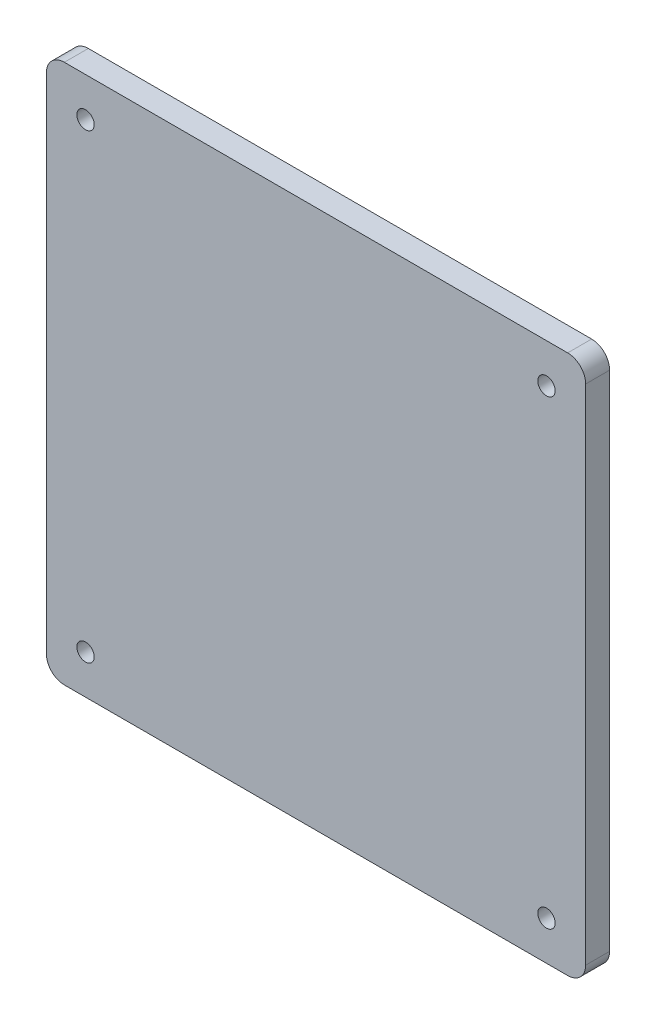
ISO-10303-21;
HEADER;
FILE_DESCRIPTION(('STEP AP214'),'2;1');
FILE_NAME('part.step','',(''),(''),'','','');
FILE_SCHEMA(('AUTOMOTIVE_DESIGN { 1 0 10303 214 1 1 1 1 }'));
ENDSEC;
DATA;
#1=APPLICATION_CONTEXT('core data for automotive mechanical design processes');
#2=APPLICATION_PROTOCOL_DEFINITION('international standard','automotive_design',2000,#1);
#3=PRODUCT_CONTEXT('',#1,'mechanical');
#4=PRODUCT('Part','Part','',(#3));
#5=PRODUCT_RELATED_PRODUCT_CATEGORY('part','',(#4));
#6=PRODUCT_DEFINITION_FORMATION('','',#4);
#7=PRODUCT_DEFINITION_CONTEXT('part definition',#1,'design');
#8=PRODUCT_DEFINITION('design','',#6,#7);
#9=PRODUCT_DEFINITION_SHAPE('','',#8);
#10=(LENGTH_UNIT() NAMED_UNIT(*) SI_UNIT(.MILLI.,.METRE.));
#11=(NAMED_UNIT(*) PLANE_ANGLE_UNIT() SI_UNIT($,.RADIAN.));
#12=(NAMED_UNIT(*) SI_UNIT($,.STERADIAN.) SOLID_ANGLE_UNIT());
#13=UNCERTAINTY_MEASURE_WITH_UNIT(LENGTH_MEASURE(1.E-05),#10,'distance_accuracy_value','');
#14=(GEOMETRIC_REPRESENTATION_CONTEXT(3) GLOBAL_UNCERTAINTY_ASSIGNED_CONTEXT((#13)) GLOBAL_UNIT_ASSIGNED_CONTEXT((#10,
#11,#12)) REPRESENTATION_CONTEXT('',''));
#15=CARTESIAN_POINT('',(0.,0.,0.));
#16=DIRECTION('',(0.,0.,1.));
#17=DIRECTION('',(1.,0.,0.));
#18=AXIS2_PLACEMENT_3D('',#15,#16,#17);
#19=CARTESIAN_POINT('',(42.0000000000008,42.000000000001,4.));
#20=DIRECTION('',(0.,0.,1.));
#21=DIRECTION('',(1.,0.,0.));
#22=AXIS2_PLACEMENT_3D('',#19,#20,#21);
#23=PLANE('',#22);
#24=CARTESIAN_POINT('',(38.4644660940683,38.4644660940681,4.));
#25=DIRECTION('',(0.,0.,1.));
#26=DIRECTION('',(1.,0.,0.));
#27=AXIS2_PLACEMENT_3D('',#24,#25,#26);
#28=CIRCLE('',#27,1.45000000000001);
#29=CARTESIAN_POINT('',(39.9144660940683,38.4644660940681,4.));
#30=VERTEX_POINT('',#29);
#31=EDGE_CURVE('E194',#30,#30,#28,.T.);
#32=ORIENTED_EDGE('',*,*,#31,.F.);
#33=EDGE_LOOP('',(#32));
#34=FACE_BOUND('',#33,.T.);
#35=CARTESIAN_POINT('',(-38.4644660940686,-38.4644660940678,4.));
#36=DIRECTION('',(0.,0.,1.));
#37=DIRECTION('',(1.,0.,0.));
#38=AXIS2_PLACEMENT_3D('',#35,#36,#37);
#39=CIRCLE('',#38,1.45);
#40=CARTESIAN_POINT('',(-37.0144660940686,-38.4644660940678,4.));
#41=VERTEX_POINT('',#40);
#42=EDGE_CURVE('E140',#41,#41,#39,.T.);
#43=ORIENTED_EDGE('',*,*,#42,.F.);
#44=EDGE_LOOP('',(#43));
#45=FACE_BOUND('',#44,.T.);
#46=CARTESIAN_POINT('',(42.0000000000008,42.000000000001,4.));
#47=DIRECTION('',(0.,0.,1.));
#48=DIRECTION('',(1.,0.,0.));
#49=AXIS2_PLACEMENT_3D('',#46,#47,#48);
#50=CIRCLE('',#49,3.);
#51=CARTESIAN_POINT('',(45.0000000000008,42.000000000001,4.));
#52=VERTEX_POINT('',#51);
#53=CARTESIAN_POINT('',(42.0000000000008,45.000000000001,4.));
#54=VERTEX_POINT('',#53);
#55=EDGE_CURVE('E151',#52,#54,#50,.T.);
#56=ORIENTED_EDGE('',*,*,#55,.T.);
#57=DIRECTION('',(-1.,0.,0.));
#58=VECTOR('',#57,1.);
#59=CARTESIAN_POINT('',(42.0000000000008,45.000000000001,4.));
#60=LINE('',#59,#58);
#61=CARTESIAN_POINT('',(-42.0000000000009,45.000000000001,4.));
#62=VERTEX_POINT('',#61);
#63=EDGE_CURVE('E99',#54,#62,#60,.T.);
#64=ORIENTED_EDGE('',*,*,#63,.T.);
#65=CARTESIAN_POINT('',(-42.0000000000009,42.000000000001,4.));
#66=DIRECTION('',(0.,0.,1.));
#67=DIRECTION('',(1.,0.,0.));
#68=AXIS2_PLACEMENT_3D('',#65,#66,#67);
#69=CIRCLE('',#68,3.);
#70=CARTESIAN_POINT('',(-45.0000000000009,42.000000000001,4.));
#71=VERTEX_POINT('',#70);
#72=EDGE_CURVE('E166',#62,#71,#69,.T.);
#73=ORIENTED_EDGE('',*,*,#72,.T.);
#74=DIRECTION('',(0.,-1.,0.));
#75=VECTOR('',#74,1.);
#76=CARTESIAN_POINT('',(-45.0000000000009,42.000000000001,4.));
#77=LINE('',#76,#75);
#78=CARTESIAN_POINT('',(-45.0000000000009,-41.9999999999992,4.));
#79=VERTEX_POINT('',#78);
#80=EDGE_CURVE('E179',#71,#79,#77,.T.);
#81=ORIENTED_EDGE('',*,*,#80,.T.);
#82=CARTESIAN_POINT('',(-42.0000000000009,-41.9999999999992,4.));
#83=DIRECTION('',(0.,0.,1.));
#84=DIRECTION('',(1.,0.,0.));
#85=AXIS2_PLACEMENT_3D('',#82,#83,#84);
#86=CIRCLE('',#85,3.);
#87=CARTESIAN_POINT('',(-42.0000000000009,-44.9999999999992,4.));
#88=VERTEX_POINT('',#87);
#89=EDGE_CURVE('E118',#79,#88,#86,.T.);
#90=ORIENTED_EDGE('',*,*,#89,.T.);
#91=DIRECTION('',(1.,0.,0.));
#92=VECTOR('',#91,1.);
#93=CARTESIAN_POINT('',(42.,-45.,4.));
#94=LINE('',#93,#92);
#95=CARTESIAN_POINT('',(42.,-45.,4.));
#96=VERTEX_POINT('',#95);
#97=EDGE_CURVE('E112',#88,#96,#94,.T.);
#98=ORIENTED_EDGE('',*,*,#97,.T.);
#99=CARTESIAN_POINT('',(42.,-42.,4.));
#100=DIRECTION('',(0.,0.,1.));
#101=DIRECTION('',(1.,0.,0.));
#102=AXIS2_PLACEMENT_3D('',#99,#100,#101);
#103=CIRCLE('',#102,3.);
#104=CARTESIAN_POINT('',(45.,-42.,4.));
#105=VERTEX_POINT('',#104);
#106=EDGE_CURVE('E116',#96,#105,#103,.T.);
#107=ORIENTED_EDGE('',*,*,#106,.T.);
#108=DIRECTION('',(0.,1.,0.));
#109=VECTOR('',#108,1.);
#110=CARTESIAN_POINT('',(45.0000000000008,42.000000000001,4.));
#111=LINE('',#110,#109);
#112=EDGE_CURVE('E56',#105,#52,#111,.T.);
#113=ORIENTED_EDGE('',*,*,#112,.T.);
#114=EDGE_LOOP('',(#56,#64,#73,#81,#90,#98,#107,#113));
#115=FACE_BOUND('',#114,.T.);
#116=CARTESIAN_POINT('',(38.4644660940679,-38.4644660940685,4.));
#117=DIRECTION('',(0.,0.,1.));
#118=DIRECTION('',(1.,0.,0.));
#119=AXIS2_PLACEMENT_3D('',#116,#117,#118);
#120=CIRCLE('',#119,1.44999999999999);
#121=CARTESIAN_POINT('',(39.9144660940679,-38.4644660940685,4.));
#122=VERTEX_POINT('',#121);
#123=EDGE_CURVE('E188',#122,#122,#120,.T.);
#124=ORIENTED_EDGE('',*,*,#123,.F.);
#125=EDGE_LOOP('',(#124));
#126=FACE_BOUND('',#125,.T.);
#127=CARTESIAN_POINT('',(-38.4644660940682,38.4644660940682,4.));
#128=DIRECTION('',(0.,0.,1.));
#129=DIRECTION('',(1.,0.,0.));
#130=AXIS2_PLACEMENT_3D('',#127,#128,#129);
#131=CIRCLE('',#130,1.45);
#132=CARTESIAN_POINT('',(-37.0144660940682,38.4644660940682,4.));
#133=VERTEX_POINT('',#132);
#134=EDGE_CURVE('E200',#133,#133,#131,.T.);
#135=ORIENTED_EDGE('',*,*,#134,.F.);
#136=EDGE_LOOP('',(#135));
#137=FACE_BOUND('',#136,.T.);
#138=ADVANCED_FACE('F39',(#34,#45,#115,#126,#137),#23,.T.);
#139=CARTESIAN_POINT('',(42.0000000000008,42.000000000001,0.));
#140=DIRECTION('',(0.,0.,1.));
#141=DIRECTION('',(1.,0.,0.));
#142=AXIS2_PLACEMENT_3D('',#139,#140,#141);
#143=PLANE('',#142);
#144=CARTESIAN_POINT('',(42.0000000000008,42.000000000001,0.));
#145=DIRECTION('',(0.,0.,1.));
#146=DIRECTION('',(1.,0.,0.));
#147=AXIS2_PLACEMENT_3D('',#144,#145,#146);
#148=CIRCLE('',#147,3.);
#149=CARTESIAN_POINT('',(45.0000000000008,42.000000000001,0.));
#150=VERTEX_POINT('',#149);
#151=CARTESIAN_POINT('',(42.0000000000008,45.000000000001,0.));
#152=VERTEX_POINT('',#151);
#153=EDGE_CURVE('E136',#150,#152,#148,.T.);
#154=ORIENTED_EDGE('',*,*,#153,.F.);
#155=DIRECTION('',(0.,1.,0.));
#156=VECTOR('',#155,1.);
#157=CARTESIAN_POINT('',(45.0000000000008,42.000000000001,0.));
#158=LINE('',#157,#156);
#159=CARTESIAN_POINT('',(45.,-42.,0.));
#160=VERTEX_POINT('',#159);
#161=EDGE_CURVE('E91',#160,#150,#158,.T.);
#162=ORIENTED_EDGE('',*,*,#161,.F.);
#163=CARTESIAN_POINT('',(42.,-42.,0.));
#164=DIRECTION('',(0.,0.,1.));
#165=DIRECTION('',(1.,0.,0.));
#166=AXIS2_PLACEMENT_3D('',#163,#164,#165);
#167=CIRCLE('',#166,3.);
#168=CARTESIAN_POINT('',(42.,-45.,0.));
#169=VERTEX_POINT('',#168);
#170=EDGE_CURVE('E85',#169,#160,#167,.T.);
#171=ORIENTED_EDGE('',*,*,#170,.F.);
#172=DIRECTION('',(1.,0.,0.));
#173=VECTOR('',#172,1.);
#174=CARTESIAN_POINT('',(42.,-45.,0.));
#175=LINE('',#174,#173);
#176=CARTESIAN_POINT('',(-42.0000000000009,-44.9999999999992,0.));
#177=VERTEX_POINT('',#176);
#178=EDGE_CURVE('E126',#177,#169,#175,.T.);
#179=ORIENTED_EDGE('',*,*,#178,.F.);
#180=CARTESIAN_POINT('',(-42.0000000000009,-41.9999999999992,0.));
#181=DIRECTION('',(0.,0.,1.));
#182=DIRECTION('',(1.,0.,0.));
#183=AXIS2_PLACEMENT_3D('',#180,#181,#182);
#184=CIRCLE('',#183,3.);
#185=CARTESIAN_POINT('',(-45.0000000000009,-41.9999999999992,0.));
#186=VERTEX_POINT('',#185);
#187=EDGE_CURVE('E146',#186,#177,#184,.T.);
#188=ORIENTED_EDGE('',*,*,#187,.F.);
#189=DIRECTION('',(0.,-1.,0.));
#190=VECTOR('',#189,1.);
#191=CARTESIAN_POINT('',(-45.0000000000009,42.000000000001,0.));
#192=LINE('',#191,#190);
#193=CARTESIAN_POINT('',(-45.0000000000009,42.000000000001,0.));
#194=VERTEX_POINT('',#193);
#195=EDGE_CURVE('E144',#194,#186,#192,.T.);
#196=ORIENTED_EDGE('',*,*,#195,.F.);
#197=CARTESIAN_POINT('',(-42.0000000000009,42.000000000001,0.));
#198=DIRECTION('',(0.,0.,1.));
#199=DIRECTION('',(1.,0.,0.));
#200=AXIS2_PLACEMENT_3D('',#197,#198,#199);
#201=CIRCLE('',#200,3.);
#202=CARTESIAN_POINT('',(-42.0000000000009,45.000000000001,0.));
#203=VERTEX_POINT('',#202);
#204=EDGE_CURVE('E142',#203,#194,#201,.T.);
#205=ORIENTED_EDGE('',*,*,#204,.F.);
#206=DIRECTION('',(-1.,0.,0.));
#207=VECTOR('',#206,1.);
#208=CARTESIAN_POINT('',(42.0000000000008,45.000000000001,0.));
#209=LINE('',#208,#207);
#210=EDGE_CURVE('E139',#152,#203,#209,.T.);
#211=ORIENTED_EDGE('',*,*,#210,.F.);
#212=EDGE_LOOP('',(#154,#162,#171,#179,#188,#196,#205,#211));
#213=FACE_BOUND('',#212,.T.);
#214=CARTESIAN_POINT('',(-38.4644660940686,-38.4644660940678,0.));
#215=DIRECTION('',(0.,0.,1.));
#216=DIRECTION('',(1.,0.,0.));
#217=AXIS2_PLACEMENT_3D('',#214,#215,#216);
#218=CIRCLE('',#217,1.45);
#219=CARTESIAN_POINT('',(-37.0144660940686,-38.4644660940678,0.));
#220=VERTEX_POINT('',#219);
#221=EDGE_CURVE('E185',#220,#220,#218,.T.);
#222=ORIENTED_EDGE('',*,*,#221,.T.);
#223=EDGE_LOOP('',(#222));
#224=FACE_BOUND('',#223,.T.);
#225=CARTESIAN_POINT('',(38.4644660940679,-38.4644660940685,0.));
#226=DIRECTION('',(0.,0.,1.));
#227=DIRECTION('',(1.,0.,0.));
#228=AXIS2_PLACEMENT_3D('',#225,#226,#227);
#229=CIRCLE('',#228,1.44999999999999);
#230=CARTESIAN_POINT('',(39.9144660940679,-38.4644660940685,0.));
#231=VERTEX_POINT('',#230);
#232=EDGE_CURVE('E191',#231,#231,#229,.T.);
#233=ORIENTED_EDGE('',*,*,#232,.T.);
#234=EDGE_LOOP('',(#233));
#235=FACE_BOUND('',#234,.T.);
#236=CARTESIAN_POINT('',(38.4644660940683,38.4644660940681,0.));
#237=DIRECTION('',(0.,0.,1.));
#238=DIRECTION('',(1.,0.,0.));
#239=AXIS2_PLACEMENT_3D('',#236,#237,#238);
#240=CIRCLE('',#239,1.45000000000001);
#241=CARTESIAN_POINT('',(39.9144660940683,38.4644660940681,0.));
#242=VERTEX_POINT('',#241);
#243=EDGE_CURVE('E197',#242,#242,#240,.T.);
#244=ORIENTED_EDGE('',*,*,#243,.T.);
#245=EDGE_LOOP('',(#244));
#246=FACE_BOUND('',#245,.T.);
#247=CARTESIAN_POINT('',(-38.4644660940682,38.4644660940682,0.));
#248=DIRECTION('',(0.,0.,1.));
#249=DIRECTION('',(1.,0.,0.));
#250=AXIS2_PLACEMENT_3D('',#247,#248,#249);
#251=CIRCLE('',#250,1.45);
#252=CARTESIAN_POINT('',(-37.0144660940682,38.4644660940682,0.));
#253=VERTEX_POINT('',#252);
#254=EDGE_CURVE('E203',#253,#253,#251,.T.);
#255=ORIENTED_EDGE('',*,*,#254,.T.);
#256=EDGE_LOOP('',(#255));
#257=FACE_BOUND('',#256,.T.);
#258=ADVANCED_FACE('F170',(#213,#224,#235,#246,#257),#143,.F.);
#259=CARTESIAN_POINT('',(42.0000000000008,42.000000000001,4.));
#260=DIRECTION('',(0.,0.,-1.));
#261=DIRECTION('',(-1.,0.,0.));
#262=AXIS2_PLACEMENT_3D('',#259,#260,#261);
#263=CYLINDRICAL_SURFACE('',#262,3.);
#264=ORIENTED_EDGE('',*,*,#153,.T.);
#265=DIRECTION('',(0.,0.,-1.));
#266=VECTOR('',#265,1.);
#267=CARTESIAN_POINT('',(42.0000000000008,45.000000000001,4.));
#268=LINE('',#267,#266);
#269=EDGE_CURVE('E11',#54,#152,#268,.T.);
#270=ORIENTED_EDGE('',*,*,#269,.F.);
#271=ORIENTED_EDGE('',*,*,#55,.F.);
#272=DIRECTION('',(0.,0.,-1.));
#273=VECTOR('',#272,1.);
#274=CARTESIAN_POINT('',(45.0000000000008,42.000000000001,4.));
#275=LINE('',#274,#273);
#276=EDGE_CURVE('E132',#52,#150,#275,.T.);
#277=ORIENTED_EDGE('',*,*,#276,.T.);
#278=EDGE_LOOP('',(#264,#270,#271,#277));
#279=FACE_BOUND('',#278,.T.);
#280=ADVANCED_FACE('F41',(#279),#263,.T.);
#281=CARTESIAN_POINT('',(42.0000000000008,45.000000000001,4.));
#282=DIRECTION('',(0.,-1.,0.));
#283=DIRECTION('',(0.,0.,-1.));
#284=AXIS2_PLACEMENT_3D('',#281,#282,#283);
#285=PLANE('',#284);
#286=ORIENTED_EDGE('',*,*,#210,.T.);
#287=DIRECTION('',(0.,0.,-1.));
#288=VECTOR('',#287,1.);
#289=CARTESIAN_POINT('',(-42.0000000000009,45.000000000001,4.));
#290=LINE('',#289,#288);
#291=EDGE_CURVE('E48',#62,#203,#290,.T.);
#292=ORIENTED_EDGE('',*,*,#291,.F.);
#293=ORIENTED_EDGE('',*,*,#63,.F.);
#294=ORIENTED_EDGE('',*,*,#269,.T.);
#295=EDGE_LOOP('',(#286,#292,#293,#294));
#296=FACE_BOUND('',#295,.T.);
#297=ADVANCED_FACE('F237',(#296),#285,.F.);
#298=CARTESIAN_POINT('',(-42.0000000000009,42.000000000001,4.));
#299=DIRECTION('',(0.,0.,-1.));
#300=DIRECTION('',(-1.,0.,0.));
#301=AXIS2_PLACEMENT_3D('',#298,#299,#300);
#302=CYLINDRICAL_SURFACE('',#301,3.);
#303=ORIENTED_EDGE('',*,*,#204,.T.);
#304=DIRECTION('',(0.,0.,-1.));
#305=VECTOR('',#304,1.);
#306=CARTESIAN_POINT('',(-45.0000000000009,42.000000000001,4.));
#307=LINE('',#306,#305);
#308=EDGE_CURVE('E158',#71,#194,#307,.T.);
#309=ORIENTED_EDGE('',*,*,#308,.F.);
#310=ORIENTED_EDGE('',*,*,#72,.F.);
#311=ORIENTED_EDGE('',*,*,#291,.T.);
#312=EDGE_LOOP('',(#303,#309,#310,#311));
#313=FACE_BOUND('',#312,.T.);
#314=ADVANCED_FACE('F164',(#313),#302,.T.);
#315=CARTESIAN_POINT('',(-45.0000000000009,42.000000000001,4.));
#316=DIRECTION('',(1.,0.,0.));
#317=DIRECTION('',(0.,0.,-1.));
#318=AXIS2_PLACEMENT_3D('',#315,#316,#317);
#319=PLANE('',#318);
#320=ORIENTED_EDGE('',*,*,#195,.T.);
#321=DIRECTION('',(0.,0.,-1.));
#322=VECTOR('',#321,1.);
#323=CARTESIAN_POINT('',(-45.0000000000009,-41.9999999999992,4.));
#324=LINE('',#323,#322);
#325=EDGE_CURVE('E155',#79,#186,#324,.T.);
#326=ORIENTED_EDGE('',*,*,#325,.F.);
#327=ORIENTED_EDGE('',*,*,#80,.F.);
#328=ORIENTED_EDGE('',*,*,#308,.T.);
#329=EDGE_LOOP('',(#320,#326,#327,#328));
#330=FACE_BOUND('',#329,.T.);
#331=ADVANCED_FACE('F175',(#330),#319,.F.);
#332=CARTESIAN_POINT('',(-42.0000000000009,-41.9999999999992,4.));
#333=DIRECTION('',(0.,0.,-1.));
#334=DIRECTION('',(-1.,0.,0.));
#335=AXIS2_PLACEMENT_3D('',#332,#333,#334);
#336=CYLINDRICAL_SURFACE('',#335,3.);
#337=ORIENTED_EDGE('',*,*,#187,.T.);
#338=DIRECTION('',(0.,0.,-1.));
#339=VECTOR('',#338,1.);
#340=CARTESIAN_POINT('',(-42.0000000000009,-44.9999999999992,4.));
#341=LINE('',#340,#339);
#342=EDGE_CURVE('E127',#88,#177,#341,.T.);
#343=ORIENTED_EDGE('',*,*,#342,.F.);
#344=ORIENTED_EDGE('',*,*,#89,.F.);
#345=ORIENTED_EDGE('',*,*,#325,.T.);
#346=EDGE_LOOP('',(#337,#343,#344,#345));
#347=FACE_BOUND('',#346,.T.);
#348=ADVANCED_FACE('F178',(#347),#336,.T.);
#349=CARTESIAN_POINT('',(42.,-45.,4.));
#350=DIRECTION('',(0.,1.,0.));
#351=DIRECTION('',(-1.,0.,0.));
#352=AXIS2_PLACEMENT_3D('',#349,#350,#351);
#353=PLANE('',#352);
#354=ORIENTED_EDGE('',*,*,#178,.T.);
#355=DIRECTION('',(0.,0.,-1.));
#356=VECTOR('',#355,1.);
#357=CARTESIAN_POINT('',(42.,-45.,4.));
#358=LINE('',#357,#356);
#359=EDGE_CURVE('E123',#96,#169,#358,.T.);
#360=ORIENTED_EDGE('',*,*,#359,.F.);
#361=ORIENTED_EDGE('',*,*,#97,.F.);
#362=ORIENTED_EDGE('',*,*,#342,.T.);
#363=EDGE_LOOP('',(#354,#360,#361,#362));
#364=FACE_BOUND('',#363,.T.);
#365=ADVANCED_FACE('F124',(#364),#353,.F.);
#366=CARTESIAN_POINT('',(42.,-42.,4.));
#367=DIRECTION('',(0.,0.,-1.));
#368=DIRECTION('',(-1.,0.,0.));
#369=AXIS2_PLACEMENT_3D('',#366,#367,#368);
#370=CYLINDRICAL_SURFACE('',#369,3.);
#371=ORIENTED_EDGE('',*,*,#170,.T.);
#372=DIRECTION('',(0.,0.,-1.));
#373=VECTOR('',#372,1.);
#374=CARTESIAN_POINT('',(45.,-42.,4.));
#375=LINE('',#374,#373);
#376=EDGE_CURVE('E128',#105,#160,#375,.T.);
#377=ORIENTED_EDGE('',*,*,#376,.F.);
#378=ORIENTED_EDGE('',*,*,#106,.F.);
#379=ORIENTED_EDGE('',*,*,#359,.T.);
#380=EDGE_LOOP('',(#371,#377,#378,#379));
#381=FACE_BOUND('',#380,.T.);
#382=ADVANCED_FACE('F130',(#381),#370,.T.);
#383=CARTESIAN_POINT('',(45.0000000000008,42.000000000001,4.));
#384=DIRECTION('',(-1.,0.,0.));
#385=DIRECTION('',(0.,-1.,0.));
#386=AXIS2_PLACEMENT_3D('',#383,#384,#385);
#387=PLANE('',#386);
#388=ORIENTED_EDGE('',*,*,#161,.T.);
#389=ORIENTED_EDGE('',*,*,#276,.F.);
#390=ORIENTED_EDGE('',*,*,#112,.F.);
#391=ORIENTED_EDGE('',*,*,#376,.T.);
#392=EDGE_LOOP('',(#388,#389,#390,#391));
#393=FACE_BOUND('',#392,.T.);
#394=ADVANCED_FACE('F225',(#393),#387,.F.);
#395=CARTESIAN_POINT('',(-38.4644660940686,-38.4644660940678,4.));
#396=DIRECTION('',(0.,0.,-1.));
#397=DIRECTION('',(-1.,0.,0.));
#398=AXIS2_PLACEMENT_3D('',#395,#396,#397);
#399=CYLINDRICAL_SURFACE('',#398,1.45);
#400=ORIENTED_EDGE('',*,*,#42,.T.);
#401=EDGE_LOOP('',(#400));
#402=FACE_BOUND('',#401,.T.);
#403=ORIENTED_EDGE('',*,*,#221,.F.);
#404=EDGE_LOOP('',(#403));
#405=FACE_BOUND('',#404,.T.);
#406=ADVANCED_FACE('F222',(#402,#405),#399,.F.);
#407=CARTESIAN_POINT('',(38.4644660940679,-38.4644660940685,4.));
#408=DIRECTION('',(0.,0.,-1.));
#409=DIRECTION('',(-1.,0.,0.));
#410=AXIS2_PLACEMENT_3D('',#407,#408,#409);
#411=CYLINDRICAL_SURFACE('',#410,1.44999999999999);
#412=ORIENTED_EDGE('',*,*,#123,.T.);
#413=EDGE_LOOP('',(#412));
#414=FACE_BOUND('',#413,.T.);
#415=ORIENTED_EDGE('',*,*,#232,.F.);
#416=EDGE_LOOP('',(#415));
#417=FACE_BOUND('',#416,.T.);
#418=ADVANCED_FACE('F300',(#414,#417),#411,.F.);
#419=CARTESIAN_POINT('',(38.4644660940683,38.4644660940681,4.));
#420=DIRECTION('',(0.,0.,-1.));
#421=DIRECTION('',(-1.,0.,0.));
#422=AXIS2_PLACEMENT_3D('',#419,#420,#421);
#423=CYLINDRICAL_SURFACE('',#422,1.45000000000001);
#424=ORIENTED_EDGE('',*,*,#31,.T.);
#425=EDGE_LOOP('',(#424));
#426=FACE_BOUND('',#425,.T.);
#427=ORIENTED_EDGE('',*,*,#243,.F.);
#428=EDGE_LOOP('',(#427));
#429=FACE_BOUND('',#428,.T.);
#430=ADVANCED_FACE('F308',(#426,#429),#423,.F.);
#431=CARTESIAN_POINT('',(-38.4644660940682,38.4644660940682,4.));
#432=DIRECTION('',(0.,0.,-1.));
#433=DIRECTION('',(-1.,0.,0.));
#434=AXIS2_PLACEMENT_3D('',#431,#432,#433);
#435=CYLINDRICAL_SURFACE('',#434,1.45);
#436=ORIENTED_EDGE('',*,*,#134,.T.);
#437=EDGE_LOOP('',(#436));
#438=FACE_BOUND('',#437,.T.);
#439=ORIENTED_EDGE('',*,*,#254,.F.);
#440=EDGE_LOOP('',(#439));
#441=FACE_BOUND('',#440,.T.);
#442=ADVANCED_FACE('F209',(#438,#441),#435,.F.);
#443=CLOSED_SHELL('',(#138,#258,#280,#297,#314,#331,#348,#365,#382,#394,#406,#418,#430,#442));
#444=MANIFOLD_SOLID_BREP('B2',#443);
#445=ADVANCED_BREP_SHAPE_REPRESENTATION('',(#18,#444),#14);
#446=SHAPE_DEFINITION_REPRESENTATION(#9,#445);
ENDSEC;
END-ISO-10303-21;
